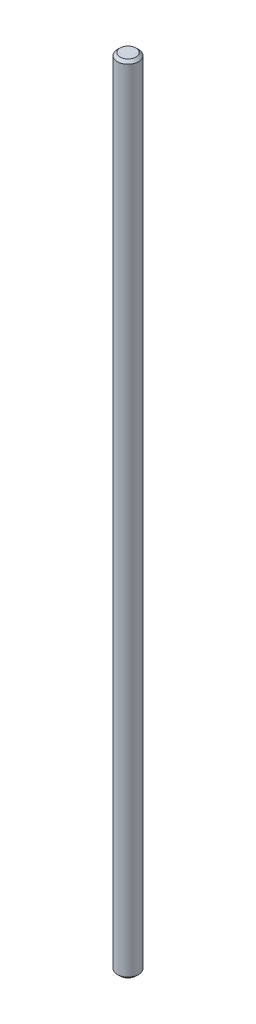
ISO-10303-21;
HEADER;
FILE_DESCRIPTION(('STEP AP214'),'2;1');
FILE_NAME('part.step','',(''),(''),'','','');
FILE_SCHEMA(('AUTOMOTIVE_DESIGN { 1 0 10303 214 1 1 1 1 }'));
ENDSEC;
DATA;
#1=APPLICATION_CONTEXT('core data for automotive mechanical design processes');
#2=APPLICATION_PROTOCOL_DEFINITION('international standard','automotive_design',2000,#1);
#3=PRODUCT_CONTEXT('',#1,'mechanical');
#4=PRODUCT('Part','Part','',(#3));
#5=PRODUCT_RELATED_PRODUCT_CATEGORY('part','',(#4));
#6=PRODUCT_DEFINITION_FORMATION('','',#4);
#7=PRODUCT_DEFINITION_CONTEXT('part definition',#1,'design');
#8=PRODUCT_DEFINITION('design','',#6,#7);
#9=PRODUCT_DEFINITION_SHAPE('','',#8);
#10=(LENGTH_UNIT() NAMED_UNIT(*) SI_UNIT(.MILLI.,.METRE.));
#11=(NAMED_UNIT(*) PLANE_ANGLE_UNIT() SI_UNIT($,.RADIAN.));
#12=(NAMED_UNIT(*) SI_UNIT($,.STERADIAN.) SOLID_ANGLE_UNIT());
#13=UNCERTAINTY_MEASURE_WITH_UNIT(LENGTH_MEASURE(1.E-05),#10,'distance_accuracy_value','');
#14=(GEOMETRIC_REPRESENTATION_CONTEXT(3) GLOBAL_UNCERTAINTY_ASSIGNED_CONTEXT((#13)) GLOBAL_UNIT_ASSIGNED_CONTEXT((#10,
#11,#12)) REPRESENTATION_CONTEXT('',''));
#15=CARTESIAN_POINT('',(0.,0.,0.));
#16=DIRECTION('',(0.,0.,1.));
#17=DIRECTION('',(1.,0.,0.));
#18=AXIS2_PLACEMENT_3D('',#15,#16,#17);
#19=CARTESIAN_POINT('',(0.,300.,0.));
#20=DIRECTION('',(0.,-1.,0.));
#21=DIRECTION('',(0.,0.,-1.));
#22=AXIS2_PLACEMENT_3D('',#19,#20,#21);
#23=CYLINDRICAL_SURFACE('',#22,4.);
#24=CARTESIAN_POINT('',(0.,1.00000000000006,0.));
#25=DIRECTION('',(0.,1.,0.));
#26=DIRECTION('',(0.,0.,1.));
#27=AXIS2_PLACEMENT_3D('',#24,#25,#26);
#28=CIRCLE('',#27,4.);
#29=CARTESIAN_POINT('',(0.,1.00000000000006,4.));
#30=VERTEX_POINT('',#29);
#31=EDGE_CURVE('E48',#30,#30,#28,.T.);
#32=ORIENTED_EDGE('',*,*,#31,.T.);
#33=EDGE_LOOP('',(#32));
#34=FACE_BOUND('',#33,.T.);
#35=CARTESIAN_POINT('',(0.,299.,0.));
#36=DIRECTION('',(0.,1.,0.));
#37=DIRECTION('',(0.,0.,1.));
#38=AXIS2_PLACEMENT_3D('',#35,#36,#37);
#39=CIRCLE('',#38,4.);
#40=CARTESIAN_POINT('',(0.,299.,4.));
#41=VERTEX_POINT('',#40);
#42=EDGE_CURVE('E52',#41,#41,#39,.F.);
#43=ORIENTED_EDGE('',*,*,#42,.T.);
#44=EDGE_LOOP('',(#43));
#45=FACE_BOUND('',#44,.T.);
#46=ADVANCED_FACE('F36',(#34,#45),#23,.T.);
#47=CARTESIAN_POINT('',(0.,300.,0.));
#48=DIRECTION('',(0.,1.,0.));
#49=DIRECTION('',(0.,0.,1.));
#50=AXIS2_PLACEMENT_3D('',#47,#48,#49);
#51=PLANE('',#50);
#52=CARTESIAN_POINT('',(0.,300.,0.));
#53=DIRECTION('',(0.,1.,0.));
#54=DIRECTION('',(0.,0.,1.));
#55=AXIS2_PLACEMENT_3D('',#52,#53,#54);
#56=CIRCLE('',#55,2.99999999999998);
#57=CARTESIAN_POINT('',(0.,300.,2.99999999999998));
#58=VERTEX_POINT('',#57);
#59=EDGE_CURVE('E10',#58,#58,#56,.T.);
#60=ORIENTED_EDGE('',*,*,#59,.T.);
#61=EDGE_LOOP('',(#60));
#62=FACE_BOUND('',#61,.T.);
#63=ADVANCED_FACE('F68',(#62),#51,.T.);
#64=CARTESIAN_POINT('',(0.,0.,0.));
#65=DIRECTION('',(0.,1.,0.));
#66=DIRECTION('',(0.,0.,1.));
#67=AXIS2_PLACEMENT_3D('',#64,#65,#66);
#68=PLANE('',#67);
#69=CARTESIAN_POINT('',(0.,0.,0.));
#70=DIRECTION('',(0.,1.,0.));
#71=DIRECTION('',(0.,0.,1.));
#72=AXIS2_PLACEMENT_3D('',#69,#70,#71);
#73=CIRCLE('',#72,2.99999999999992);
#74=CARTESIAN_POINT('',(0.,0.,2.99999999999992));
#75=VERTEX_POINT('',#74);
#76=EDGE_CURVE('E44',#75,#75,#73,.F.);
#77=ORIENTED_EDGE('',*,*,#76,.T.);
#78=EDGE_LOOP('',(#77));
#79=FACE_BOUND('',#78,.T.);
#80=ADVANCED_FACE('F65',(#79),#68,.F.);
#81=CARTESIAN_POINT('',(0.,1.00000000000006,0.));
#82=DIRECTION('',(0.,1.,0.));
#83=DIRECTION('',(0.,0.,1.));
#84=AXIS2_PLACEMENT_3D('',#81,#82,#83);
#85=CONICAL_SURFACE('',#84,4.,0.785398163397461);
#86=ORIENTED_EDGE('',*,*,#76,.F.);
#87=EDGE_LOOP('',(#86));
#88=FACE_BOUND('',#87,.T.);
#89=ORIENTED_EDGE('',*,*,#31,.F.);
#90=EDGE_LOOP('',(#89));
#91=FACE_BOUND('',#90,.T.);
#92=ADVANCED_FACE('F61',(#88,#91),#85,.T.);
#93=CARTESIAN_POINT('',(0.,300.,0.));
#94=DIRECTION('',(0.,-1.,0.));
#95=DIRECTION('',(0.,0.,-1.));
#96=AXIS2_PLACEMENT_3D('',#93,#94,#95);
#97=CONICAL_SURFACE('',#96,2.99999999999998,0.785398163397461);
#98=ORIENTED_EDGE('',*,*,#42,.F.);
#99=EDGE_LOOP('',(#98));
#100=FACE_BOUND('',#99,.T.);
#101=ORIENTED_EDGE('',*,*,#59,.F.);
#102=EDGE_LOOP('',(#101));
#103=FACE_BOUND('',#102,.T.);
#104=ADVANCED_FACE('F39',(#100,#103),#97,.T.);
#105=CLOSED_SHELL('',(#46,#63,#80,#92,#104));
#106=MANIFOLD_SOLID_BREP('B2',#105);
#107=ADVANCED_BREP_SHAPE_REPRESENTATION('',(#18,#106),#14);
#108=SHAPE_DEFINITION_REPRESENTATION(#9,#107);
ENDSEC;
END-ISO-10303-21;
